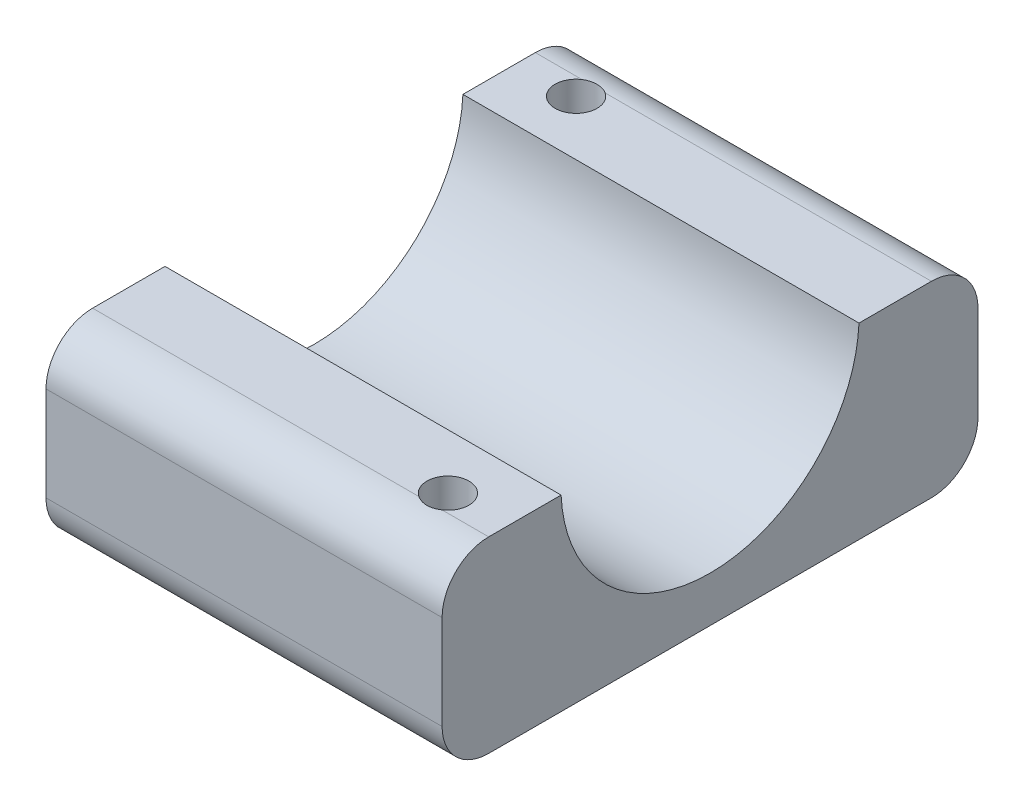
ISO-10303-21;
HEADER;
FILE_DESCRIPTION(('STEP AP214'),'2;1');
FILE_NAME('part.step','',(''),(''),'','','');
FILE_SCHEMA(('AUTOMOTIVE_DESIGN { 1 0 10303 214 1 1 1 1 }'));
ENDSEC;
DATA;
#1=APPLICATION_CONTEXT('core data for automotive mechanical design processes');
#2=APPLICATION_PROTOCOL_DEFINITION('international standard','automotive_design',2000,#1);
#3=PRODUCT_CONTEXT('',#1,'mechanical');
#4=PRODUCT('Part','Part','',(#3));
#5=PRODUCT_RELATED_PRODUCT_CATEGORY('part','',(#4));
#6=PRODUCT_DEFINITION_FORMATION('','',#4);
#7=PRODUCT_DEFINITION_CONTEXT('part definition',#1,'design');
#8=PRODUCT_DEFINITION('design','',#6,#7);
#9=PRODUCT_DEFINITION_SHAPE('','',#8);
#10=(LENGTH_UNIT() NAMED_UNIT(*) SI_UNIT(.MILLI.,.METRE.));
#11=(NAMED_UNIT(*) PLANE_ANGLE_UNIT() SI_UNIT($,.RADIAN.));
#12=(NAMED_UNIT(*) SI_UNIT($,.STERADIAN.) SOLID_ANGLE_UNIT());
#13=UNCERTAINTY_MEASURE_WITH_UNIT(LENGTH_MEASURE(1.E-05),#10,'distance_accuracy_value','');
#14=(GEOMETRIC_REPRESENTATION_CONTEXT(3) GLOBAL_UNCERTAINTY_ASSIGNED_CONTEXT((#13)) GLOBAL_UNIT_ASSIGNED_CONTEXT((#10,
#11,#12)) REPRESENTATION_CONTEXT('',''));
#15=CARTESIAN_POINT('',(0.,0.,0.));
#16=DIRECTION('',(0.,0.,1.));
#17=DIRECTION('',(1.,0.,0.));
#18=AXIS2_PLACEMENT_3D('',#15,#16,#17);
#19=CARTESIAN_POINT('',(17.,-12.7,19.));
#20=DIRECTION('',(-1.,0.,0.));
#21=DIRECTION('',(0.,0.,1.));
#22=AXIS2_PLACEMENT_3D('',#19,#20,#21);
#23=CYLINDRICAL_SURFACE('',#22,4.);
#24=CARTESIAN_POINT('',(14.8831406486677,-16.7,19.));
#25=CARTESIAN_POINT('',(14.8426506773485,-16.7000109242073,19.0778574955817));
#26=CARTESIAN_POINT('',(14.799000228987,-16.6977274477931,19.1540259495156));
#27=CARTESIAN_POINT('',(14.7058465588756,-16.6892434582838,19.3023684001236));
#28=CARTESIAN_POINT('',(14.6563491198335,-16.6830467894245,19.3745462414952));
#29=CARTESIAN_POINT('',(14.5521394497937,-16.6674431467714,19.5141099444437));
#30=CARTESIAN_POINT('',(14.4974534105728,-16.6580517369091,19.5815171592083));
#31=CARTESIAN_POINT('',(14.3830963067864,-16.6367588944703,19.7115277345354));
#32=CARTESIAN_POINT('',(14.3234240657577,-16.624856868514,19.7741299546666));
#33=CARTESIAN_POINT('',(14.137958520912,-16.5865410499203,19.9538040445996));
#34=CARTESIAN_POINT('',(14.0052730523629,-16.5574402181653,20.063333735106));
#35=CARTESIAN_POINT('',(13.7244267415197,-16.4977204142456,20.2601369098951));
#36=CARTESIAN_POINT('',(13.576240301189,-16.4670989762058,20.3473727339024));
#37=CARTESIAN_POINT('',(13.2554948894781,-16.4077377901675,20.5033912591476));
#38=CARTESIAN_POINT('',(13.0819397555766,-16.3793171325302,20.5702714707651));
#39=CARTESIAN_POINT('',(12.7247230253625,-16.3334988458983,20.67360310912));
#40=CARTESIAN_POINT('',(12.541074540201,-16.3160872676328,20.7100930611152));
#41=CARTESIAN_POINT('',(12.1801211742974,-16.2970438866187,20.7497826168194));
#42=CARTESIAN_POINT('',(12.0030606959685,-16.2945604785481,20.7547796461988));
#43=CARTESIAN_POINT('',(11.6508551478767,-16.303665315988,20.7360004114565));
#44=CARTESIAN_POINT('',(11.4757100720865,-16.3152535172044,20.7122242379062));
#45=CARTESIAN_POINT('',(11.1432131791046,-16.3488250161309,20.6393688950356));
#46=CARTESIAN_POINT('',(10.9854273142967,-16.3701323340066,20.5919187162139));
#47=CARTESIAN_POINT('',(10.6795530268689,-16.4189794615007,20.4741906823131));
#48=CARTESIAN_POINT('',(10.5314732871055,-16.4465247559277,20.4038927142524));
#49=CARTESIAN_POINT('',(10.2349555579031,-16.5058026088642,20.2347450945025));
#50=CARTESIAN_POINT('',(10.0876893410615,-16.5376887696085,20.13389244722));
#51=CARTESIAN_POINT('',(9.81126908660816,-16.5970581196079,19.9090688065648));
#52=CARTESIAN_POINT('',(9.68208622636505,-16.624548325662,19.7851353533026));
#53=CARTESIAN_POINT('',(9.4767689193668,-16.6629034475965,19.5525613074241));
#54=CARTESIAN_POINT('',(9.39568604242196,-16.6762483146135,19.4486923027872));
#55=CARTESIAN_POINT('',(9.28369159763862,-16.6901621549613,19.2856467872631));
#56=CARTESIAN_POINT('',(9.24792841576943,-16.6937835167149,19.2300209908782));
#57=CARTESIAN_POINT('',(9.17979814905551,-16.6987044935031,19.1165845685182));
#58=CARTESIAN_POINT('',(9.14743311817267,-16.7000027118666,19.058772649559));
#59=CARTESIAN_POINT('',(9.1168593513323,-16.7,19.));
#60=B_SPLINE_CURVE_WITH_KNOTS('',3,(#24,#25,#26,#27,#28,#29,#30,#31,#32,#33,#34,#35,#36,#37,#38,
#39,#40,#41,#42,#43,#44,#45,#46,#47,#48,#49,#50,#51,#52,#53,#54,#55,#56,#57,#58,#59),
.UNSPECIFIED.,.F.,.F.,(4,2,2,2,2,2,2,2,2,2,2,2,2,2,2,2,2,4),(0.,0.263108350436764,
0.525958630143497,0.78754628825429,1.0491958415726,1.5702947033418,2.09226810629026,
2.65384856233941,3.21471602330402,3.74325888086913,4.27180007470835,4.76815579490835,
5.26494964749648,5.80654118475775,6.34725941618147,6.7433968577492,6.94193709517688,
7.140596654703),.UNSPECIFIED.);
#61=CARTESIAN_POINT('',(14.8831406486677,-16.7,19.));
#62=VERTEX_POINT('',#61);
#63=CARTESIAN_POINT('',(9.1168593513323,-16.7,19.));
#64=VERTEX_POINT('',#63);
#65=EDGE_CURVE('E62',#62,#64,#60,.T.);
#66=ORIENTED_EDGE('',*,*,#65,.F.);
#67=DIRECTION('',(-1.,0.,0.));
#68=VECTOR('',#67,1.);
#69=CARTESIAN_POINT('',(17.,-16.7,19.));
#70=LINE('',#69,#68);
#71=CARTESIAN_POINT('',(17.,-16.7,19.));
#72=VERTEX_POINT('',#71);
#73=EDGE_CURVE('E166',#72,#62,#70,.T.);
#74=ORIENTED_EDGE('',*,*,#73,.F.);
#75=CARTESIAN_POINT('',(17.,-12.7,19.));
#76=DIRECTION('',(1.,0.,0.));
#77=DIRECTION('',(0.,0.,-1.));
#78=AXIS2_PLACEMENT_3D('',#75,#76,#77);
#79=CIRCLE('',#78,4.);
#80=CARTESIAN_POINT('',(17.,-12.7,23.));
#81=VERTEX_POINT('',#80);
#82=EDGE_CURVE('E235',#81,#72,#79,.T.);
#83=ORIENTED_EDGE('',*,*,#82,.F.);
#84=DIRECTION('',(-1.,0.,0.));
#85=VECTOR('',#84,1.);
#86=CARTESIAN_POINT('',(17.,-12.7,23.));
#87=LINE('',#86,#85);
#88=CARTESIAN_POINT('',(-17.,-12.7,23.));
#89=VERTEX_POINT('',#88);
#90=EDGE_CURVE('E262',#81,#89,#87,.T.);
#91=ORIENTED_EDGE('',*,*,#90,.T.);
#92=CARTESIAN_POINT('',(-17.,-12.7,19.));
#93=DIRECTION('',(1.,0.,0.));
#94=DIRECTION('',(0.,0.,-1.));
#95=AXIS2_PLACEMENT_3D('',#92,#93,#94);
#96=CIRCLE('',#95,4.);
#97=CARTESIAN_POINT('',(-17.,-16.7,19.));
#98=VERTEX_POINT('',#97);
#99=EDGE_CURVE('E263',#89,#98,#96,.T.);
#100=ORIENTED_EDGE('',*,*,#99,.T.);
#101=EDGE_CURVE('E160',#64,#98,#70,.T.);
#102=ORIENTED_EDGE('',*,*,#101,.F.);
#103=EDGE_LOOP('',(#66,#74,#83,#91,#100,#102));
#104=FACE_BOUND('',#103,.T.);
#105=ADVANCED_FACE('F39',(#104),#23,.T.);
#106=CARTESIAN_POINT('',(17.,-12.7,-19.));
#107=DIRECTION('',(-1.,0.,0.));
#108=DIRECTION('',(0.,0.,1.));
#109=AXIS2_PLACEMENT_3D('',#106,#107,#108);
#110=CYLINDRICAL_SURFACE('',#109,4.);
#111=CARTESIAN_POINT('',(-14.8831406486677,-16.7,-19.));
#112=CARTESIAN_POINT('',(-14.8426506773485,-16.7000109242073,-19.0778574955817));
#113=CARTESIAN_POINT('',(-14.799000228987,-16.6977274477931,-19.1540259495156));
#114=CARTESIAN_POINT('',(-14.7058465588756,-16.6892434582838,-19.3023684001236));
#115=CARTESIAN_POINT('',(-14.6563491198335,-16.6830467894245,-19.3745462414952));
#116=CARTESIAN_POINT('',(-14.5521394497937,-16.6674431467714,-19.5141099444437));
#117=CARTESIAN_POINT('',(-14.4974534105728,-16.6580517369091,-19.5815171592083));
#118=CARTESIAN_POINT('',(-14.3830963067864,-16.6367588944703,-19.7115277345354));
#119=CARTESIAN_POINT('',(-14.3234240657577,-16.624856868514,-19.7741299546666));
#120=CARTESIAN_POINT('',(-14.137958520912,-16.5865410499203,-19.9538040445996));
#121=CARTESIAN_POINT('',(-14.0052730523629,-16.5574402181653,-20.063333735106));
#122=CARTESIAN_POINT('',(-13.7244267415197,-16.4977204142456,-20.2601369098951));
#123=CARTESIAN_POINT('',(-13.576240301189,-16.4670989762058,-20.3473727339024));
#124=CARTESIAN_POINT('',(-13.2554948894781,-16.4077377901675,-20.5033912591476));
#125=CARTESIAN_POINT('',(-13.0819397555766,-16.3793171325302,-20.5702714707651));
#126=CARTESIAN_POINT('',(-12.7247230253625,-16.3334988458983,-20.67360310912));
#127=CARTESIAN_POINT('',(-12.541074540201,-16.3160872676328,-20.7100930611152));
#128=CARTESIAN_POINT('',(-12.1801211742974,-16.2970438866187,-20.7497826168194));
#129=CARTESIAN_POINT('',(-12.0030606959685,-16.2945604785481,-20.7547796461988));
#130=CARTESIAN_POINT('',(-11.6508551478767,-16.303665315988,-20.7360004114565));
#131=CARTESIAN_POINT('',(-11.4757100720865,-16.3152535172044,-20.7122242379062));
#132=CARTESIAN_POINT('',(-11.1432131791046,-16.3488250161309,-20.6393688950356));
#133=CARTESIAN_POINT('',(-10.9854273142967,-16.3701323340066,-20.5919187162139));
#134=CARTESIAN_POINT('',(-10.6795530268689,-16.4189794615007,-20.4741906823131));
#135=CARTESIAN_POINT('',(-10.5314732871055,-16.4465247559277,-20.4038927142524));
#136=CARTESIAN_POINT('',(-10.2349555579031,-16.5058026088642,-20.2347450945025));
#137=CARTESIAN_POINT('',(-10.0876893410615,-16.5376887696085,-20.13389244722));
#138=CARTESIAN_POINT('',(-9.81126908660816,-16.5970581196079,-19.9090688065648));
#139=CARTESIAN_POINT('',(-9.68208622636505,-16.624548325662,-19.7851353533026));
#140=CARTESIAN_POINT('',(-9.4767689193668,-16.6629034475965,-19.5525613074241));
#141=CARTESIAN_POINT('',(-9.39568604242196,-16.6762483146135,-19.4486923027872));
#142=CARTESIAN_POINT('',(-9.28369159763862,-16.6901621549613,-19.2856467872631));
#143=CARTESIAN_POINT('',(-9.24792841576943,-16.6937835167149,-19.2300209908782));
#144=CARTESIAN_POINT('',(-9.17979814905551,-16.6987044935031,-19.1165845685182));
#145=CARTESIAN_POINT('',(-9.14743311817267,-16.7000027118666,-19.058772649559));
#146=CARTESIAN_POINT('',(-9.1168593513323,-16.7,-19.));
#147=B_SPLINE_CURVE_WITH_KNOTS('',3,(#111,#112,#113,#114,#115,#116,#117,#118,#119,#120,#121,
#122,#123,#124,#125,#126,#127,#128,#129,#130,#131,#132,#133,#134,#135,#136,#137,#138,#139,#140,
#141,#142,#143,#144,#145,#146),.UNSPECIFIED.,.F.,.F.,(4,2,2,2,2,2,2,2,2,2,2,2,2,2,2,2,2,4),(0.,
0.263108350436764,0.525958630143497,0.78754628825429,1.0491958415726,1.5702947033418,
2.09226810629026,2.65384856233941,3.21471602330402,3.74325888086913,4.27180007470835,
4.76815579490835,5.26494964749648,5.80654118475775,6.34725941618147,6.7433968577492,
6.94193709517688,7.140596654703),.UNSPECIFIED.);
#148=CARTESIAN_POINT('',(-14.8831406486677,-16.7,-19.));
#149=VERTEX_POINT('',#148);
#150=CARTESIAN_POINT('',(-9.1168593513323,-16.7,-19.));
#151=VERTEX_POINT('',#150);
#152=EDGE_CURVE('E55',#149,#151,#147,.T.);
#153=ORIENTED_EDGE('',*,*,#152,.F.);
#154=DIRECTION('',(-1.,0.,0.));
#155=VECTOR('',#154,1.);
#156=CARTESIAN_POINT('',(17.,-16.7,-19.));
#157=LINE('',#156,#155);
#158=CARTESIAN_POINT('',(-17.,-16.7,-19.));
#159=VERTEX_POINT('',#158);
#160=EDGE_CURVE('E149',#149,#159,#157,.T.);
#161=ORIENTED_EDGE('',*,*,#160,.T.);
#162=CARTESIAN_POINT('',(-17.,-12.7,-19.));
#163=DIRECTION('',(1.,0.,0.));
#164=DIRECTION('',(0.,0.,-1.));
#165=AXIS2_PLACEMENT_3D('',#162,#163,#164);
#166=CIRCLE('',#165,4.);
#167=CARTESIAN_POINT('',(-17.,-12.7,-23.));
#168=VERTEX_POINT('',#167);
#169=EDGE_CURVE('E266',#159,#168,#166,.T.);
#170=ORIENTED_EDGE('',*,*,#169,.T.);
#171=DIRECTION('',(-1.,0.,0.));
#172=VECTOR('',#171,1.);
#173=CARTESIAN_POINT('',(17.,-12.7,-23.));
#174=LINE('',#173,#172);
#175=CARTESIAN_POINT('',(17.,-12.7,-23.));
#176=VERTEX_POINT('',#175);
#177=EDGE_CURVE('E158',#176,#168,#174,.T.);
#178=ORIENTED_EDGE('',*,*,#177,.F.);
#179=CARTESIAN_POINT('',(17.,-12.7,-19.));
#180=DIRECTION('',(1.,0.,0.));
#181=DIRECTION('',(0.,0.,-1.));
#182=AXIS2_PLACEMENT_3D('',#179,#180,#181);
#183=CIRCLE('',#182,4.);
#184=CARTESIAN_POINT('',(17.,-16.7,-19.));
#185=VERTEX_POINT('',#184);
#186=EDGE_CURVE('E234',#185,#176,#183,.T.);
#187=ORIENTED_EDGE('',*,*,#186,.F.);
#188=EDGE_CURVE('E152',#185,#151,#157,.T.);
#189=ORIENTED_EDGE('',*,*,#188,.T.);
#190=EDGE_LOOP('',(#153,#161,#170,#178,#187,#189));
#191=FACE_BOUND('',#190,.T.);
#192=ADVANCED_FACE('F148',(#191),#110,.T.);
#193=CARTESIAN_POINT('',(17.,-4.6,-19.));
#194=DIRECTION('',(-1.,0.,0.));
#195=DIRECTION('',(0.,0.,1.));
#196=AXIS2_PLACEMENT_3D('',#193,#194,#195);
#197=CYLINDRICAL_SURFACE('',#196,4.);
#198=CARTESIAN_POINT('',(-11.0050125628934,-0.6,-19.));
#199=CARTESIAN_POINT('',(-11.0471919494141,-0.600002290201008,-19.0279782687762));
#200=CARTESIAN_POINT('',(-11.0905300624338,-0.600293109258532,-19.054162436945));
#201=CARTESIAN_POINT('',(-11.1792493356974,-0.601246630542694,-19.1027880961604));
#202=CARTESIAN_POINT('',(-11.224630336906,-0.601909303866988,-19.1252298779078));
#203=CARTESIAN_POINT('',(-11.3632919534806,-0.60414515604213,-19.1866521635867));
#204=CARTESIAN_POINT('',(-11.4592244258047,-0.605967454515857,-19.2198177956695));
#205=CARTESIAN_POINT('',(-11.6552891209815,-0.609016111648687,-19.2695824039112));
#206=CARTESIAN_POINT('',(-11.7554228470139,-0.610242254997947,-19.2861753969049));
#207=CARTESIAN_POINT('',(-11.9570747060166,-0.611432977587128,-19.3023260095373));
#208=CARTESIAN_POINT('',(-12.0585927592301,-0.611397629202323,-19.3018846064864));
#209=CARTESIAN_POINT('',(-12.2599850427663,-0.610084395953699,-19.2839916011113));
#210=CARTESIAN_POINT('',(-12.3598608656075,-0.608807797075412,-19.266557603754));
#211=CARTESIAN_POINT('',(-12.555237018111,-0.605710678825216,-19.2151942389305));
#212=CARTESIAN_POINT('',(-12.6507408400042,-0.603890602630139,-19.181278297527));
#213=CARTESIAN_POINT('',(-12.7865371051718,-0.601745422922836,-19.1197807652606));
#214=CARTESIAN_POINT('',(-12.8296054345031,-0.601136078493984,-19.0981480345368));
#215=CARTESIAN_POINT('',(-12.9137908330242,-0.600264553601652,-19.0515455180329));
#216=CARTESIAN_POINT('',(-12.9549115439312,-0.600001698383489,-19.0265823227808));
#217=CARTESIAN_POINT('',(-12.9949874371066,-0.6,-19.));
#218=B_SPLINE_CURVE_WITH_KNOTS('',3,(#198,#199,#200,#201,#202,#203,#204,#205,#206,#207,#208,
#209,#210,#211,#212,#213,#214,#215,#216,#217),.UNSPECIFIED.,.F.,.F.,(4,2,2,2,2,2,2,2,2,4),(0.,
0.151748564164442,0.30348533531734,0.606485618853393,0.909595254081968,1.21268749909945,
1.51546606256915,1.81799839737315,1.96246492195647,2.10664969408635),.UNSPECIFIED.);
#219=CARTESIAN_POINT('',(-11.0050125628934,-0.6,-19.));
#220=VERTEX_POINT('',#219);
#221=CARTESIAN_POINT('',(-12.9949874371066,-0.6,-19.));
#222=VERTEX_POINT('',#221);
#223=EDGE_CURVE('E11',#220,#222,#218,.T.);
#224=ORIENTED_EDGE('',*,*,#223,.F.);
#225=DIRECTION('',(-1.,0.,0.));
#226=VECTOR('',#225,1.);
#227=CARTESIAN_POINT('',(17.,-0.6,-19.));
#228=LINE('',#227,#226);
#229=CARTESIAN_POINT('',(17.,-0.6,-19.));
#230=VERTEX_POINT('',#229);
#231=EDGE_CURVE('E287',#230,#220,#228,.T.);
#232=ORIENTED_EDGE('',*,*,#231,.F.);
#233=CARTESIAN_POINT('',(17.,-4.6,-19.));
#234=DIRECTION('',(1.,0.,0.));
#235=DIRECTION('',(0.,0.,-1.));
#236=AXIS2_PLACEMENT_3D('',#233,#234,#235);
#237=CIRCLE('',#236,4.);
#238=CARTESIAN_POINT('',(17.,-4.6,-23.));
#239=VERTEX_POINT('',#238);
#240=EDGE_CURVE('E253',#239,#230,#237,.T.);
#241=ORIENTED_EDGE('',*,*,#240,.F.);
#242=DIRECTION('',(-1.,0.,0.));
#243=VECTOR('',#242,1.);
#244=CARTESIAN_POINT('',(17.,-4.6,-23.));
#245=LINE('',#244,#243);
#246=CARTESIAN_POINT('',(-17.,-4.6,-23.));
#247=VERTEX_POINT('',#246);
#248=EDGE_CURVE('E162',#239,#247,#245,.T.);
#249=ORIENTED_EDGE('',*,*,#248,.T.);
#250=CARTESIAN_POINT('',(-17.,-4.6,-19.));
#251=DIRECTION('',(1.,0.,0.));
#252=DIRECTION('',(0.,0.,-1.));
#253=AXIS2_PLACEMENT_3D('',#250,#251,#252);
#254=CIRCLE('',#253,4.);
#255=CARTESIAN_POINT('',(-17.,-0.6,-19.));
#256=VERTEX_POINT('',#255);
#257=EDGE_CURVE('E270',#247,#256,#254,.T.);
#258=ORIENTED_EDGE('',*,*,#257,.T.);
#259=EDGE_CURVE('E286',#222,#256,#228,.T.);
#260=ORIENTED_EDGE('',*,*,#259,.F.);
#261=EDGE_LOOP('',(#224,#232,#241,#249,#258,#260));
#262=FACE_BOUND('',#261,.T.);
#263=ADVANCED_FACE('F224',(#262),#197,.T.);
#264=CARTESIAN_POINT('',(17.,-4.6,19.));
#265=DIRECTION('',(-1.,0.,0.));
#266=DIRECTION('',(0.,0.,1.));
#267=AXIS2_PLACEMENT_3D('',#264,#265,#266);
#268=CYLINDRICAL_SURFACE('',#267,4.);
#269=CARTESIAN_POINT('',(11.0050125628934,-0.6,19.));
#270=CARTESIAN_POINT('',(11.0471919494141,-0.600002290201008,19.0279782687762));
#271=CARTESIAN_POINT('',(11.0905300624338,-0.600293109258532,19.054162436945));
#272=CARTESIAN_POINT('',(11.1792493356974,-0.601246630542694,19.1027880961604));
#273=CARTESIAN_POINT('',(11.224630336906,-0.601909303866988,19.1252298779078));
#274=CARTESIAN_POINT('',(11.3632919534806,-0.60414515604213,19.1866521635867));
#275=CARTESIAN_POINT('',(11.4592244258047,-0.605967454515857,19.2198177956695));
#276=CARTESIAN_POINT('',(11.6552891209815,-0.609016111648687,19.2695824039112));
#277=CARTESIAN_POINT('',(11.7554228470139,-0.610242254997947,19.2861753969049));
#278=CARTESIAN_POINT('',(11.9570747060166,-0.611432977587128,19.3023260095373));
#279=CARTESIAN_POINT('',(12.0585927592301,-0.611397629202323,19.3018846064864));
#280=CARTESIAN_POINT('',(12.2599850427663,-0.610084395953699,19.2839916011113));
#281=CARTESIAN_POINT('',(12.3598608656075,-0.608807797075412,19.266557603754));
#282=CARTESIAN_POINT('',(12.555237018111,-0.605710678825216,19.2151942389305));
#283=CARTESIAN_POINT('',(12.6507408400042,-0.603890602630139,19.181278297527));
#284=CARTESIAN_POINT('',(12.7865371051718,-0.601745422922836,19.1197807652606));
#285=CARTESIAN_POINT('',(12.8296054345031,-0.601136078493984,19.0981480345368));
#286=CARTESIAN_POINT('',(12.9137908330242,-0.600264553601652,19.0515455180329));
#287=CARTESIAN_POINT('',(12.9549115439312,-0.600001698383489,19.0265823227808));
#288=CARTESIAN_POINT('',(12.9949874371066,-0.6,19.));
#289=B_SPLINE_CURVE_WITH_KNOTS('',3,(#269,#270,#271,#272,#273,#274,#275,#276,#277,#278,#279,
#280,#281,#282,#283,#284,#285,#286,#287,#288),.UNSPECIFIED.,.F.,.F.,(4,2,2,2,2,2,2,2,2,4),(0.,
0.151748564164442,0.30348533531734,0.606485618853393,0.909595254081968,1.21268749909945,
1.51546606256915,1.81799839737315,1.96246492195647,2.10664969408635),.UNSPECIFIED.);
#290=CARTESIAN_POINT('',(11.0050125628934,-0.6,19.));
#291=VERTEX_POINT('',#290);
#292=CARTESIAN_POINT('',(12.9949874371066,-0.6,19.));
#293=VERTEX_POINT('',#292);
#294=EDGE_CURVE('E48',#291,#293,#289,.T.);
#295=ORIENTED_EDGE('',*,*,#294,.F.);
#296=DIRECTION('',(-1.,0.,0.));
#297=VECTOR('',#296,1.);
#298=CARTESIAN_POINT('',(17.,-0.6,19.));
#299=LINE('',#298,#297);
#300=CARTESIAN_POINT('',(-17.,-0.6,19.));
#301=VERTEX_POINT('',#300);
#302=EDGE_CURVE('E282',#291,#301,#299,.T.);
#303=ORIENTED_EDGE('',*,*,#302,.T.);
#304=CARTESIAN_POINT('',(-17.,-4.6,19.));
#305=DIRECTION('',(1.,0.,0.));
#306=DIRECTION('',(0.,0.,-1.));
#307=AXIS2_PLACEMENT_3D('',#304,#305,#306);
#308=CIRCLE('',#307,4.);
#309=CARTESIAN_POINT('',(-17.,-4.6,23.));
#310=VERTEX_POINT('',#309);
#311=EDGE_CURVE('E244',#301,#310,#308,.T.);
#312=ORIENTED_EDGE('',*,*,#311,.T.);
#313=DIRECTION('',(-1.,0.,0.));
#314=VECTOR('',#313,1.);
#315=CARTESIAN_POINT('',(17.,-4.6,23.));
#316=LINE('',#315,#314);
#317=CARTESIAN_POINT('',(17.,-4.6,23.));
#318=VERTEX_POINT('',#317);
#319=EDGE_CURVE('E279',#318,#310,#316,.T.);
#320=ORIENTED_EDGE('',*,*,#319,.F.);
#321=CARTESIAN_POINT('',(17.,-4.6,19.));
#322=DIRECTION('',(1.,0.,0.));
#323=DIRECTION('',(0.,0.,-1.));
#324=AXIS2_PLACEMENT_3D('',#321,#322,#323);
#325=CIRCLE('',#324,4.);
#326=CARTESIAN_POINT('',(17.,-0.6,19.));
#327=VERTEX_POINT('',#326);
#328=EDGE_CURVE('E259',#327,#318,#325,.T.);
#329=ORIENTED_EDGE('',*,*,#328,.F.);
#330=EDGE_CURVE('E283',#327,#293,#299,.T.);
#331=ORIENTED_EDGE('',*,*,#330,.T.);
#332=EDGE_LOOP('',(#295,#303,#312,#320,#329,#331));
#333=FACE_BOUND('',#332,.T.);
#334=ADVANCED_FACE('F181',(#333),#268,.T.);
#335=CARTESIAN_POINT('',(17.,-0.6,-19.));
#336=DIRECTION('',(0.,-1.,0.));
#337=DIRECTION('',(0.,0.,-1.));
#338=AXIS2_PLACEMENT_3D('',#335,#336,#337);
#339=PLANE('',#338);
#340=CARTESIAN_POINT('',(-12.,-0.6,-17.5));
#341=DIRECTION('',(0.,-1.,0.));
#342=DIRECTION('',(0.,0.,-1.));
#343=AXIS2_PLACEMENT_3D('',#340,#341,#342);
#344=CIRCLE('',#343,1.8);
#345=EDGE_CURVE('E308',#222,#220,#344,.F.);
#346=ORIENTED_EDGE('',*,*,#345,.F.);
#347=ORIENTED_EDGE('',*,*,#259,.T.);
#348=DIRECTION('',(0.,0.,1.));
#349=VECTOR('',#348,1.);
#350=CARTESIAN_POINT('',(-17.,-0.6,-19.));
#351=LINE('',#350,#349);
#352=CARTESIAN_POINT('',(-17.,-0.6,-12.7859297667397));
#353=VERTEX_POINT('',#352);
#354=EDGE_CURVE('E274',#256,#353,#351,.T.);
#355=ORIENTED_EDGE('',*,*,#354,.T.);
#356=DIRECTION('',(1.,0.,0.));
#357=VECTOR('',#356,1.);
#358=CARTESIAN_POINT('',(-17.,-0.6,-12.7859297667397));
#359=LINE('',#358,#357);
#360=CARTESIAN_POINT('',(17.,-0.6,-12.7859297667397));
#361=VERTEX_POINT('',#360);
#362=EDGE_CURVE('E247',#353,#361,#359,.T.);
#363=ORIENTED_EDGE('',*,*,#362,.T.);
#364=DIRECTION('',(0.,0.,1.));
#365=VECTOR('',#364,1.);
#366=CARTESIAN_POINT('',(17.,-0.6,-19.));
#367=LINE('',#366,#365);
#368=EDGE_CURVE('E256',#230,#361,#367,.T.);
#369=ORIENTED_EDGE('',*,*,#368,.F.);
#370=ORIENTED_EDGE('',*,*,#231,.T.);
#371=EDGE_LOOP('',(#346,#347,#355,#363,#369,#370));
#372=FACE_BOUND('',#371,.T.);
#373=ADVANCED_FACE('F218',(#372),#339,.F.);
#374=CARTESIAN_POINT('',(17.,-16.7,19.));
#375=DIRECTION('',(0.,1.,0.));
#376=DIRECTION('',(0.,0.,1.));
#377=AXIS2_PLACEMENT_3D('',#374,#375,#376);
#378=PLANE('',#377);
#379=CARTESIAN_POINT('',(12.,-16.7,17.5));
#380=DIRECTION('',(0.,1.,0.));
#381=DIRECTION('',(0.,0.,1.));
#382=AXIS2_PLACEMENT_3D('',#379,#380,#381);
#383=CIRCLE('',#382,3.25);
#384=EDGE_CURVE('E144',#62,#64,#383,.T.);
#385=ORIENTED_EDGE('',*,*,#384,.T.);
#386=ORIENTED_EDGE('',*,*,#101,.T.);
#387=DIRECTION('',(0.,0.,-1.));
#388=VECTOR('',#387,1.);
#389=CARTESIAN_POINT('',(-17.,-16.7,19.));
#390=LINE('',#389,#388);
#391=EDGE_CURVE('E156',#98,#159,#390,.T.);
#392=ORIENTED_EDGE('',*,*,#391,.T.);
#393=ORIENTED_EDGE('',*,*,#160,.F.);
#394=CARTESIAN_POINT('',(-12.,-16.7,-17.5));
#395=DIRECTION('',(0.,1.,0.));
#396=DIRECTION('',(0.,0.,1.));
#397=AXIS2_PLACEMENT_3D('',#394,#395,#396);
#398=CIRCLE('',#397,3.25);
#399=EDGE_CURVE('E138',#149,#151,#398,.T.);
#400=ORIENTED_EDGE('',*,*,#399,.T.);
#401=ORIENTED_EDGE('',*,*,#188,.F.);
#402=DIRECTION('',(0.,0.,-1.));
#403=VECTOR('',#402,1.);
#404=CARTESIAN_POINT('',(17.,-16.7,19.));
#405=LINE('',#404,#403);
#406=EDGE_CURVE('E232',#72,#185,#405,.T.);
#407=ORIENTED_EDGE('',*,*,#406,.F.);
#408=ORIENTED_EDGE('',*,*,#73,.T.);
#409=EDGE_LOOP('',(#385,#386,#392,#393,#400,#401,#407,#408));
#410=FACE_BOUND('',#409,.T.);
#411=ADVANCED_FACE('F154',(#410),#378,.F.);
#412=CARTESIAN_POINT('',(17.,-12.7,-23.));
#413=DIRECTION('',(0.,0.,1.));
#414=DIRECTION('',(1.,0.,0.));
#415=AXIS2_PLACEMENT_3D('',#412,#413,#414);
#416=PLANE('',#415);
#417=DIRECTION('',(0.,1.,0.));
#418=VECTOR('',#417,1.);
#419=CARTESIAN_POINT('',(-17.,-12.7,-23.));
#420=LINE('',#419,#418);
#421=EDGE_CURVE('E268',#168,#247,#420,.T.);
#422=ORIENTED_EDGE('',*,*,#421,.T.);
#423=ORIENTED_EDGE('',*,*,#248,.F.);
#424=DIRECTION('',(0.,1.,0.));
#425=VECTOR('',#424,1.);
#426=CARTESIAN_POINT('',(17.,-12.7,-23.));
#427=LINE('',#426,#425);
#428=EDGE_CURVE('E251',#176,#239,#427,.T.);
#429=ORIENTED_EDGE('',*,*,#428,.F.);
#430=ORIENTED_EDGE('',*,*,#177,.T.);
#431=EDGE_LOOP('',(#422,#423,#429,#430));
#432=FACE_BOUND('',#431,.T.);
#433=ADVANCED_FACE('F216',(#432),#416,.F.);
#434=CARTESIAN_POINT('',(12.,-0.6,17.5));
#435=DIRECTION('',(0.,-1.,0.));
#436=DIRECTION('',(0.,0.,-1.));
#437=AXIS2_PLACEMENT_3D('',#434,#435,#436);
#438=CIRCLE('',#437,1.8);
#439=EDGE_CURVE('E230',#293,#291,#438,.F.);
#440=ORIENTED_EDGE('',*,*,#439,.F.);
#441=ORIENTED_EDGE('',*,*,#330,.F.);
#442=CARTESIAN_POINT('',(17.,-0.6,12.7859297667397));
#443=VERTEX_POINT('',#442);
#444=EDGE_CURVE('E255',#443,#327,#367,.T.);
#445=ORIENTED_EDGE('',*,*,#444,.F.);
#446=DIRECTION('',(1.,0.,0.));
#447=VECTOR('',#446,1.);
#448=CARTESIAN_POINT('',(-17.,-0.6,12.7859297667397));
#449=LINE('',#448,#447);
#450=CARTESIAN_POINT('',(-17.,-0.6,12.7859297667397));
#451=VERTEX_POINT('',#450);
#452=EDGE_CURVE('E324',#443,#451,#449,.F.);
#453=ORIENTED_EDGE('',*,*,#452,.T.);
#454=EDGE_CURVE('E273',#451,#301,#351,.T.);
#455=ORIENTED_EDGE('',*,*,#454,.T.);
#456=ORIENTED_EDGE('',*,*,#302,.F.);
#457=EDGE_LOOP('',(#440,#441,#445,#453,#455,#456));
#458=FACE_BOUND('',#457,.T.);
#459=ADVANCED_FACE('F210',(#458),#339,.F.);
#460=CARTESIAN_POINT('',(17.,-4.6,23.));
#461=DIRECTION('',(0.,0.,-1.));
#462=DIRECTION('',(-1.,0.,0.));
#463=AXIS2_PLACEMENT_3D('',#460,#461,#462);
#464=PLANE('',#463);
#465=DIRECTION('',(0.,-1.,0.));
#466=VECTOR('',#465,1.);
#467=CARTESIAN_POINT('',(-17.,-4.6,23.));
#468=LINE('',#467,#466);
#469=EDGE_CURVE('E242',#310,#89,#468,.T.);
#470=ORIENTED_EDGE('',*,*,#469,.T.);
#471=ORIENTED_EDGE('',*,*,#90,.F.);
#472=DIRECTION('',(0.,-1.,0.));
#473=VECTOR('',#472,1.);
#474=CARTESIAN_POINT('',(17.,-4.6,23.));
#475=LINE('',#474,#473);
#476=EDGE_CURVE('E239',#318,#81,#475,.T.);
#477=ORIENTED_EDGE('',*,*,#476,.F.);
#478=ORIENTED_EDGE('',*,*,#319,.T.);
#479=EDGE_LOOP('',(#470,#471,#477,#478));
#480=FACE_BOUND('',#479,.T.);
#481=ADVANCED_FACE('F205',(#480),#464,.F.);
#482=CARTESIAN_POINT('',(17.,-12.7,19.));
#483=DIRECTION('',(1.,0.,0.));
#484=DIRECTION('',(0.,0.,-1.));
#485=AXIS2_PLACEMENT_3D('',#482,#483,#484);
#486=PLANE('',#485);
#487=CARTESIAN_POINT('',(17.,0.,0.));
#488=DIRECTION('',(1.,0.,0.));
#489=DIRECTION('',(0.,0.,-1.));
#490=AXIS2_PLACEMENT_3D('',#487,#488,#489);
#491=CIRCLE('',#490,12.8);
#492=EDGE_CURVE('E310',#443,#361,#491,.T.);
#493=ORIENTED_EDGE('',*,*,#492,.F.);
#494=ORIENTED_EDGE('',*,*,#444,.T.);
#495=ORIENTED_EDGE('',*,*,#328,.T.);
#496=ORIENTED_EDGE('',*,*,#476,.T.);
#497=ORIENTED_EDGE('',*,*,#82,.T.);
#498=ORIENTED_EDGE('',*,*,#406,.T.);
#499=ORIENTED_EDGE('',*,*,#186,.T.);
#500=ORIENTED_EDGE('',*,*,#428,.T.);
#501=ORIENTED_EDGE('',*,*,#240,.T.);
#502=ORIENTED_EDGE('',*,*,#368,.T.);
#503=EDGE_LOOP('',(#493,#494,#495,#496,#497,#498,#499,#500,#501,#502));
#504=FACE_BOUND('',#503,.T.);
#505=ADVANCED_FACE('F202',(#504),#486,.T.);
#506=CARTESIAN_POINT('',(-17.,-12.7,19.));
#507=DIRECTION('',(1.,0.,0.));
#508=DIRECTION('',(0.,0.,-1.));
#509=AXIS2_PLACEMENT_3D('',#506,#507,#508);
#510=PLANE('',#509);
#511=ORIENTED_EDGE('',*,*,#454,.F.);
#512=CARTESIAN_POINT('',(-17.,0.,0.));
#513=DIRECTION('',(1.,0.,0.));
#514=DIRECTION('',(0.,0.,-1.));
#515=AXIS2_PLACEMENT_3D('',#512,#513,#514);
#516=CIRCLE('',#515,12.8);
#517=EDGE_CURVE('E303',#451,#353,#516,.T.);
#518=ORIENTED_EDGE('',*,*,#517,.T.);
#519=ORIENTED_EDGE('',*,*,#354,.F.);
#520=ORIENTED_EDGE('',*,*,#257,.F.);
#521=ORIENTED_EDGE('',*,*,#421,.F.);
#522=ORIENTED_EDGE('',*,*,#169,.F.);
#523=ORIENTED_EDGE('',*,*,#391,.F.);
#524=ORIENTED_EDGE('',*,*,#99,.F.);
#525=ORIENTED_EDGE('',*,*,#469,.F.);
#526=ORIENTED_EDGE('',*,*,#311,.F.);
#527=EDGE_LOOP('',(#511,#518,#519,#520,#521,#522,#523,#524,#525,#526));
#528=FACE_BOUND('',#527,.T.);
#529=ADVANCED_FACE('F200',(#528),#510,.F.);
#530=CARTESIAN_POINT('',(-17.,0.,0.));
#531=DIRECTION('',(1.,0.,0.));
#532=DIRECTION('',(0.,0.,-1.));
#533=AXIS2_PLACEMENT_3D('',#530,#531,#532);
#534=CYLINDRICAL_SURFACE('',#533,12.8);
#535=ORIENTED_EDGE('',*,*,#517,.F.);
#536=ORIENTED_EDGE('',*,*,#452,.F.);
#537=ORIENTED_EDGE('',*,*,#492,.T.);
#538=ORIENTED_EDGE('',*,*,#362,.F.);
#539=EDGE_LOOP('',(#535,#536,#537,#538));
#540=FACE_BOUND('',#539,.T.);
#541=ADVANCED_FACE('F190',(#540),#534,.F.);
#542=CARTESIAN_POINT('',(12.,0.300000000000002,17.5));
#543=DIRECTION('',(0.,-1.,0.));
#544=DIRECTION('',(0.,0.,-1.));
#545=AXIS2_PLACEMENT_3D('',#542,#543,#544);
#546=CYLINDRICAL_SURFACE('',#545,1.8);
#547=CARTESIAN_POINT('',(12.,-9.2,17.5));
#548=DIRECTION('',(0.,1.,0.));
#549=DIRECTION('',(0.,0.,1.));
#550=AXIS2_PLACEMENT_3D('',#547,#548,#549);
#551=CIRCLE('',#550,1.8);
#552=CARTESIAN_POINT('',(12.,-9.2,19.3));
#553=VERTEX_POINT('',#552);
#554=EDGE_CURVE('E43',#553,#553,#551,.T.);
#555=ORIENTED_EDGE('',*,*,#554,.F.);
#556=EDGE_LOOP('',(#555));
#557=FACE_BOUND('',#556,.T.);
#558=ORIENTED_EDGE('',*,*,#439,.T.);
#559=ORIENTED_EDGE('',*,*,#294,.T.);
#560=EDGE_LOOP('',(#558,#559));
#561=FACE_BOUND('',#560,.T.);
#562=ADVANCED_FACE('F185',(#557,#561),#546,.F.);
#563=CARTESIAN_POINT('',(-12.,0.300000000000002,-17.5));
#564=DIRECTION('',(0.,-1.,0.));
#565=DIRECTION('',(0.,0.,-1.));
#566=AXIS2_PLACEMENT_3D('',#563,#564,#565);
#567=CYLINDRICAL_SURFACE('',#566,1.8);
#568=CARTESIAN_POINT('',(-12.,-9.2,-17.5));
#569=DIRECTION('',(0.,1.,0.));
#570=DIRECTION('',(0.,0.,1.));
#571=AXIS2_PLACEMENT_3D('',#568,#569,#570);
#572=CIRCLE('',#571,1.8);
#573=CARTESIAN_POINT('',(-12.,-9.2,-15.7));
#574=VERTEX_POINT('',#573);
#575=EDGE_CURVE('E360',#574,#574,#572,.T.);
#576=ORIENTED_EDGE('',*,*,#575,.F.);
#577=EDGE_LOOP('',(#576));
#578=FACE_BOUND('',#577,.T.);
#579=ORIENTED_EDGE('',*,*,#345,.T.);
#580=ORIENTED_EDGE('',*,*,#223,.T.);
#581=EDGE_LOOP('',(#579,#580));
#582=FACE_BOUND('',#581,.T.);
#583=ADVANCED_FACE('F189',(#578,#582),#567,.F.);
#584=CARTESIAN_POINT('',(-12.,-9.2,-17.5));
#585=DIRECTION('',(0.,-1.,0.));
#586=DIRECTION('',(0.,0.,-1.));
#587=AXIS2_PLACEMENT_3D('',#584,#585,#586);
#588=CYLINDRICAL_SURFACE('',#587,3.25);
#589=CARTESIAN_POINT('',(-12.,-9.2,-17.5));
#590=DIRECTION('',(0.,1.,0.));
#591=DIRECTION('',(0.,0.,1.));
#592=AXIS2_PLACEMENT_3D('',#589,#590,#591);
#593=CIRCLE('',#592,3.25);
#594=CARTESIAN_POINT('',(-12.,-9.2,-14.25));
#595=VERTEX_POINT('',#594);
#596=EDGE_CURVE('E145',#595,#595,#593,.T.);
#597=ORIENTED_EDGE('',*,*,#596,.T.);
#598=EDGE_LOOP('',(#597));
#599=FACE_BOUND('',#598,.T.);
#600=ORIENTED_EDGE('',*,*,#152,.T.);
#601=ORIENTED_EDGE('',*,*,#399,.F.);
#602=EDGE_LOOP('',(#600,#601));
#603=FACE_BOUND('',#602,.T.);
#604=ADVANCED_FACE('F139',(#599,#603),#588,.F.);
#605=CARTESIAN_POINT('',(-12.,-9.2,-17.5));
#606=DIRECTION('',(0.,1.,0.));
#607=DIRECTION('',(0.,0.,1.));
#608=AXIS2_PLACEMENT_3D('',#605,#606,#607);
#609=PLANE('',#608);
#610=ORIENTED_EDGE('',*,*,#575,.T.);
#611=EDGE_LOOP('',(#610));
#612=FACE_BOUND('',#611,.T.);
#613=ORIENTED_EDGE('',*,*,#596,.F.);
#614=EDGE_LOOP('',(#613));
#615=FACE_BOUND('',#614,.T.);
#616=ADVANCED_FACE('F192',(#612,#615),#609,.F.);
#617=CARTESIAN_POINT('',(12.,-9.2,17.5));
#618=DIRECTION('',(0.,-1.,0.));
#619=DIRECTION('',(0.,0.,-1.));
#620=AXIS2_PLACEMENT_3D('',#617,#618,#619);
#621=CYLINDRICAL_SURFACE('',#620,3.25);
#622=CARTESIAN_POINT('',(12.,-9.2,17.5));
#623=DIRECTION('',(0.,1.,0.));
#624=DIRECTION('',(0.,0.,1.));
#625=AXIS2_PLACEMENT_3D('',#622,#623,#624);
#626=CIRCLE('',#625,3.25);
#627=CARTESIAN_POINT('',(12.,-9.2,20.75));
#628=VERTEX_POINT('',#627);
#629=EDGE_CURVE('E358',#628,#628,#626,.T.);
#630=ORIENTED_EDGE('',*,*,#629,.T.);
#631=EDGE_LOOP('',(#630));
#632=FACE_BOUND('',#631,.T.);
#633=ORIENTED_EDGE('',*,*,#65,.T.);
#634=ORIENTED_EDGE('',*,*,#384,.F.);
#635=EDGE_LOOP('',(#633,#634));
#636=FACE_BOUND('',#635,.T.);
#637=ADVANCED_FACE('F340',(#632,#636),#621,.F.);
#638=CARTESIAN_POINT('',(12.,-9.2,17.5));
#639=DIRECTION('',(0.,1.,0.));
#640=DIRECTION('',(0.,0.,1.));
#641=AXIS2_PLACEMENT_3D('',#638,#639,#640);
#642=PLANE('',#641);
#643=ORIENTED_EDGE('',*,*,#554,.T.);
#644=EDGE_LOOP('',(#643));
#645=FACE_BOUND('',#644,.T.);
#646=ORIENTED_EDGE('',*,*,#629,.F.);
#647=EDGE_LOOP('',(#646));
#648=FACE_BOUND('',#647,.T.);
#649=ADVANCED_FACE('F344',(#645,#648),#642,.F.);
#650=CLOSED_SHELL('',(#105,#192,#263,#334,#373,#411,#433,#459,#481,#505,#529,#541,#562,#583,
#604,#616,#637,#649));
#651=MANIFOLD_SOLID_BREP('B2',#650);
#652=ADVANCED_BREP_SHAPE_REPRESENTATION('',(#18,#651),#14);
#653=SHAPE_DEFINITION_REPRESENTATION(#9,#652);
ENDSEC;
END-ISO-10303-21;
